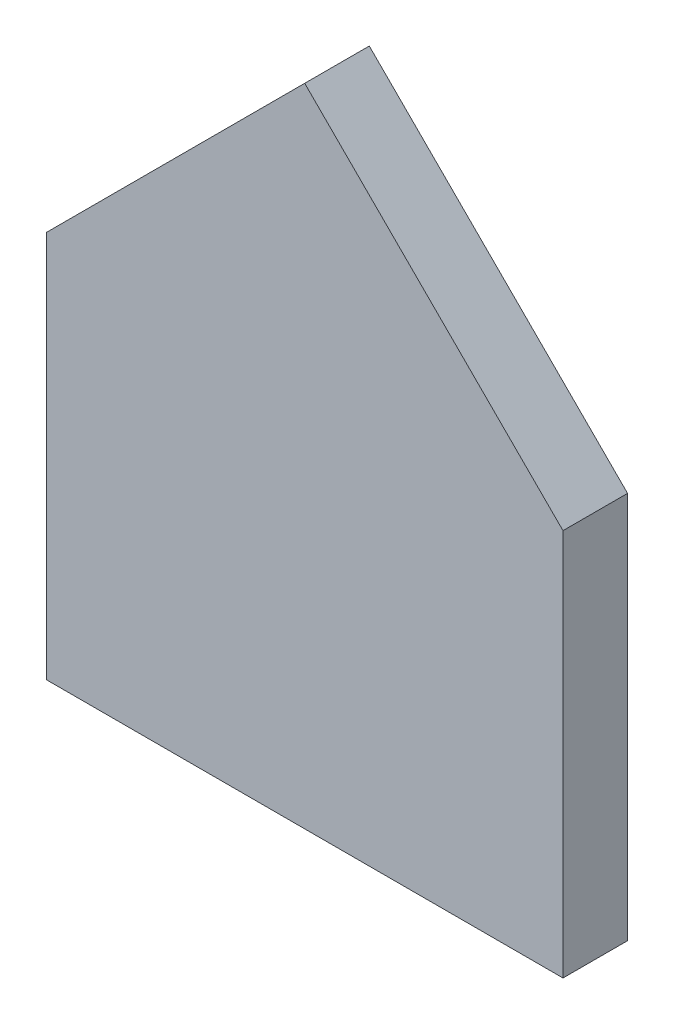
ISO-10303-21;
HEADER;
FILE_DESCRIPTION(('STEP AP214'),'2;1');
FILE_NAME('part.step','',(''),(''),'','','');
FILE_SCHEMA(('AUTOMOTIVE_DESIGN { 1 0 10303 214 1 1 1 1 }'));
ENDSEC;
DATA;
#1=APPLICATION_CONTEXT('core data for automotive mechanical design processes');
#2=APPLICATION_PROTOCOL_DEFINITION('international standard','automotive_design',2000,#1);
#3=PRODUCT_CONTEXT('',#1,'mechanical');
#4=PRODUCT('Part','Part','',(#3));
#5=PRODUCT_RELATED_PRODUCT_CATEGORY('part','',(#4));
#6=PRODUCT_DEFINITION_FORMATION('','',#4);
#7=PRODUCT_DEFINITION_CONTEXT('part definition',#1,'design');
#8=PRODUCT_DEFINITION('design','',#6,#7);
#9=PRODUCT_DEFINITION_SHAPE('','',#8);
#10=(LENGTH_UNIT() NAMED_UNIT(*) SI_UNIT(.MILLI.,.METRE.));
#11=(NAMED_UNIT(*) PLANE_ANGLE_UNIT() SI_UNIT($,.RADIAN.));
#12=(NAMED_UNIT(*) SI_UNIT($,.STERADIAN.) SOLID_ANGLE_UNIT());
#13=UNCERTAINTY_MEASURE_WITH_UNIT(LENGTH_MEASURE(1.E-05),#10,'distance_accuracy_value','');
#14=(GEOMETRIC_REPRESENTATION_CONTEXT(3) GLOBAL_UNCERTAINTY_ASSIGNED_CONTEXT((#13)) GLOBAL_UNIT_ASSIGNED_CONTEXT((#10,
#11,#12)) REPRESENTATION_CONTEXT('',''));
#15=CARTESIAN_POINT('',(0.,0.,0.));
#16=DIRECTION('',(0.,0.,1.));
#17=DIRECTION('',(1.,0.,0.));
#18=AXIS2_PLACEMENT_3D('',#15,#16,#17);
#19=CARTESIAN_POINT('',(-40.,-50.,10.));
#20=DIRECTION('',(0.,1.,0.));
#21=DIRECTION('',(0.,0.,1.));
#22=AXIS2_PLACEMENT_3D('',#19,#20,#21);
#23=PLANE('',#22);
#24=DIRECTION('',(1.,0.,0.));
#25=VECTOR('',#24,1.);
#26=CARTESIAN_POINT('',(-40.,-50.,0.));
#27=LINE('',#26,#25);
#28=CARTESIAN_POINT('',(-40.,-50.,0.));
#29=VERTEX_POINT('',#28);
#30=CARTESIAN_POINT('',(40.,-50.,0.));
#31=VERTEX_POINT('',#30);
#32=EDGE_CURVE('E106',#29,#31,#27,.T.);
#33=ORIENTED_EDGE('',*,*,#32,.T.);
#34=DIRECTION('',(0.,0.,-1.));
#35=VECTOR('',#34,1.);
#36=CARTESIAN_POINT('',(40.,-50.,10.));
#37=LINE('',#36,#35);
#38=CARTESIAN_POINT('',(40.,-50.,10.));
#39=VERTEX_POINT('',#38);
#40=EDGE_CURVE('E11',#39,#31,#37,.T.);
#41=ORIENTED_EDGE('',*,*,#40,.F.);
#42=DIRECTION('',(1.,0.,0.));
#43=VECTOR('',#42,1.);
#44=CARTESIAN_POINT('',(-40.,-50.,10.));
#45=LINE('',#44,#43);
#46=CARTESIAN_POINT('',(-40.,-50.,10.));
#47=VERTEX_POINT('',#46);
#48=EDGE_CURVE('E114',#47,#39,#45,.T.);
#49=ORIENTED_EDGE('',*,*,#48,.F.);
#50=DIRECTION('',(0.,0.,-1.));
#51=VECTOR('',#50,1.);
#52=CARTESIAN_POINT('',(-40.,-50.,10.));
#53=LINE('',#52,#51);
#54=EDGE_CURVE('E102',#47,#29,#53,.T.);
#55=ORIENTED_EDGE('',*,*,#54,.T.);
#56=EDGE_LOOP('',(#33,#41,#49,#55));
#57=FACE_BOUND('',#56,.T.);
#58=ADVANCED_FACE('F32',(#57),#23,.F.);
#59=CARTESIAN_POINT('',(40.,10.,10.));
#60=DIRECTION('',(-1.,0.,0.));
#61=DIRECTION('',(0.,0.,1.));
#62=AXIS2_PLACEMENT_3D('',#59,#60,#61);
#63=PLANE('',#62);
#64=DIRECTION('',(0.,1.,0.));
#65=VECTOR('',#64,1.);
#66=CARTESIAN_POINT('',(40.,10.,0.));
#67=LINE('',#66,#65);
#68=CARTESIAN_POINT('',(40.,10.,0.));
#69=VERTEX_POINT('',#68);
#70=EDGE_CURVE('E109',#31,#69,#67,.T.);
#71=ORIENTED_EDGE('',*,*,#70,.T.);
#72=DIRECTION('',(0.,0.,-1.));
#73=VECTOR('',#72,1.);
#74=CARTESIAN_POINT('',(40.,10.,10.));
#75=LINE('',#74,#73);
#76=CARTESIAN_POINT('',(40.,10.,10.));
#77=VERTEX_POINT('',#76);
#78=EDGE_CURVE('E40',#77,#69,#75,.T.);
#79=ORIENTED_EDGE('',*,*,#78,.F.);
#80=DIRECTION('',(0.,1.,0.));
#81=VECTOR('',#80,1.);
#82=CARTESIAN_POINT('',(40.,10.,10.));
#83=LINE('',#82,#81);
#84=EDGE_CURVE('E82',#39,#77,#83,.T.);
#85=ORIENTED_EDGE('',*,*,#84,.F.);
#86=ORIENTED_EDGE('',*,*,#40,.T.);
#87=EDGE_LOOP('',(#71,#79,#85,#86));
#88=FACE_BOUND('',#87,.T.);
#89=ADVANCED_FACE('F133',(#88),#63,.F.);
#90=CARTESIAN_POINT('',(0.,50.,10.));
#91=DIRECTION('',(-0.707106781186547,-0.707106781186548,0.));
#92=DIRECTION('',(0.707106781186548,-0.707106781186547,0.));
#93=AXIS2_PLACEMENT_3D('',#90,#91,#92);
#94=PLANE('',#93);
#95=DIRECTION('',(-0.707106781186548,0.707106781186547,0.));
#96=VECTOR('',#95,1.);
#97=CARTESIAN_POINT('',(0.,50.,0.));
#98=LINE('',#97,#96);
#99=CARTESIAN_POINT('',(0.,50.,0.));
#100=VERTEX_POINT('',#99);
#101=EDGE_CURVE('E97',#69,#100,#98,.T.);
#102=ORIENTED_EDGE('',*,*,#101,.T.);
#103=DIRECTION('',(0.,0.,-1.));
#104=VECTOR('',#103,1.);
#105=CARTESIAN_POINT('',(0.,50.,10.));
#106=LINE('',#105,#104);
#107=CARTESIAN_POINT('',(0.,50.,10.));
#108=VERTEX_POINT('',#107);
#109=EDGE_CURVE('E94',#108,#100,#106,.T.);
#110=ORIENTED_EDGE('',*,*,#109,.F.);
#111=DIRECTION('',(-0.707106781186548,0.707106781186547,0.));
#112=VECTOR('',#111,1.);
#113=CARTESIAN_POINT('',(0.,50.,10.));
#114=LINE('',#113,#112);
#115=EDGE_CURVE('E86',#77,#108,#114,.T.);
#116=ORIENTED_EDGE('',*,*,#115,.F.);
#117=ORIENTED_EDGE('',*,*,#78,.T.);
#118=EDGE_LOOP('',(#102,#110,#116,#117));
#119=FACE_BOUND('',#118,.T.);
#120=ADVANCED_FACE('F95',(#119),#94,.F.);
#121=CARTESIAN_POINT('',(-40.,9.99999999999999,10.));
#122=DIRECTION('',(0.707106781186548,-0.707106781186547,0.));
#123=DIRECTION('',(0.707106781186547,0.707106781186548,0.));
#124=AXIS2_PLACEMENT_3D('',#121,#122,#123);
#125=PLANE('',#124);
#126=DIRECTION('',(-0.707106781186547,-0.707106781186548,0.));
#127=VECTOR('',#126,1.);
#128=CARTESIAN_POINT('',(-40.,9.99999999999999,0.));
#129=LINE('',#128,#127);
#130=CARTESIAN_POINT('',(-40.,9.99999999999999,0.));
#131=VERTEX_POINT('',#130);
#132=EDGE_CURVE('E68',#100,#131,#129,.T.);
#133=ORIENTED_EDGE('',*,*,#132,.T.);
#134=DIRECTION('',(0.,0.,-1.));
#135=VECTOR('',#134,1.);
#136=CARTESIAN_POINT('',(-40.,9.99999999999999,10.));
#137=LINE('',#136,#135);
#138=CARTESIAN_POINT('',(-40.,9.99999999999999,10.));
#139=VERTEX_POINT('',#138);
#140=EDGE_CURVE('E98',#139,#131,#137,.T.);
#141=ORIENTED_EDGE('',*,*,#140,.F.);
#142=DIRECTION('',(-0.707106781186547,-0.707106781186548,0.));
#143=VECTOR('',#142,1.);
#144=CARTESIAN_POINT('',(-40.,9.99999999999999,10.));
#145=LINE('',#144,#143);
#146=EDGE_CURVE('E90',#108,#139,#145,.T.);
#147=ORIENTED_EDGE('',*,*,#146,.F.);
#148=ORIENTED_EDGE('',*,*,#109,.T.);
#149=EDGE_LOOP('',(#133,#141,#147,#148));
#150=FACE_BOUND('',#149,.T.);
#151=ADVANCED_FACE('F100',(#150),#125,.F.);
#152=CARTESIAN_POINT('',(-40.,-50.,10.));
#153=DIRECTION('',(1.,0.,0.));
#154=DIRECTION('',(0.,0.,-1.));
#155=AXIS2_PLACEMENT_3D('',#152,#153,#154);
#156=PLANE('',#155);
#157=DIRECTION('',(0.,-1.,0.));
#158=VECTOR('',#157,1.);
#159=CARTESIAN_POINT('',(-40.,-50.,0.));
#160=LINE('',#159,#158);
#161=EDGE_CURVE('E74',#131,#29,#160,.T.);
#162=ORIENTED_EDGE('',*,*,#161,.T.);
#163=ORIENTED_EDGE('',*,*,#54,.F.);
#164=DIRECTION('',(0.,-1.,0.));
#165=VECTOR('',#164,1.);
#166=CARTESIAN_POINT('',(-40.,-50.,10.));
#167=LINE('',#166,#165);
#168=EDGE_CURVE('E48',#139,#47,#167,.T.);
#169=ORIENTED_EDGE('',*,*,#168,.F.);
#170=ORIENTED_EDGE('',*,*,#140,.T.);
#171=EDGE_LOOP('',(#162,#163,#169,#170));
#172=FACE_BOUND('',#171,.T.);
#173=ADVANCED_FACE('F122',(#172),#156,.F.);
#174=CARTESIAN_POINT('',(0.,0.,10.));
#175=DIRECTION('',(0.,0.,-1.));
#176=DIRECTION('',(-1.,0.,0.));
#177=AXIS2_PLACEMENT_3D('',#174,#175,#176);
#178=PLANE('',#177);
#179=ORIENTED_EDGE('',*,*,#48,.T.);
#180=ORIENTED_EDGE('',*,*,#84,.T.);
#181=ORIENTED_EDGE('',*,*,#115,.T.);
#182=ORIENTED_EDGE('',*,*,#146,.T.);
#183=ORIENTED_EDGE('',*,*,#168,.T.);
#184=EDGE_LOOP('',(#179,#180,#181,#182,#183));
#185=FACE_BOUND('',#184,.T.);
#186=ADVANCED_FACE('F88',(#185),#178,.F.);
#187=CARTESIAN_POINT('',(0.,0.,0.));
#188=DIRECTION('',(0.,0.,-1.));
#189=DIRECTION('',(-1.,0.,0.));
#190=AXIS2_PLACEMENT_3D('',#187,#188,#189);
#191=PLANE('',#190);
#192=ORIENTED_EDGE('',*,*,#32,.F.);
#193=ORIENTED_EDGE('',*,*,#161,.F.);
#194=ORIENTED_EDGE('',*,*,#132,.F.);
#195=ORIENTED_EDGE('',*,*,#101,.F.);
#196=ORIENTED_EDGE('',*,*,#70,.F.);
#197=EDGE_LOOP('',(#192,#193,#194,#195,#196));
#198=FACE_BOUND('',#197,.T.);
#199=ADVANCED_FACE('F118',(#198),#191,.T.);
#200=CLOSED_SHELL('',(#58,#89,#120,#151,#173,#186,#199));
#201=MANIFOLD_SOLID_BREP('B2',#200);
#202=ADVANCED_BREP_SHAPE_REPRESENTATION('',(#18,#201),#14);
#203=SHAPE_DEFINITION_REPRESENTATION(#9,#202);
ENDSEC;
END-ISO-10303-21;
